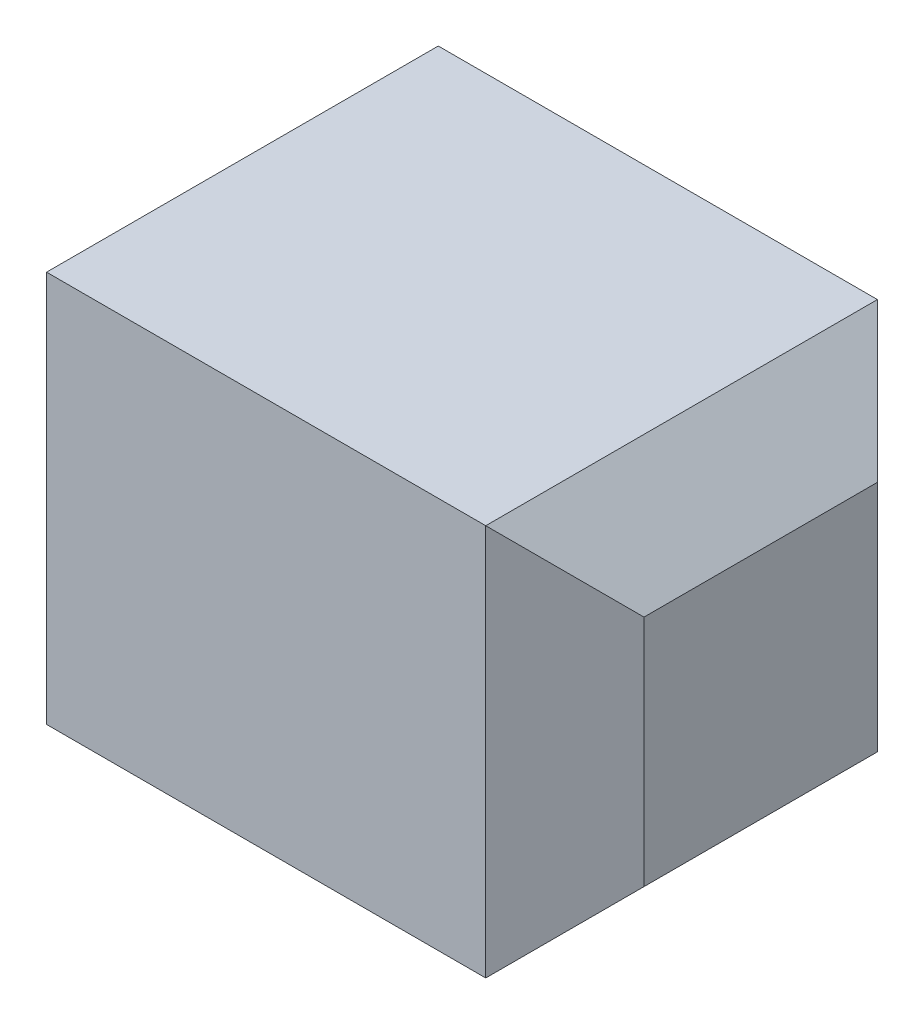
ISO-10303-21;
HEADER;
FILE_DESCRIPTION(('STEP AP214'),'2;1');
FILE_NAME('part.step','',(''),(''),'','','');
FILE_SCHEMA(('AUTOMOTIVE_DESIGN { 1 0 10303 214 1 1 1 1 }'));
ENDSEC;
DATA;
#1=APPLICATION_CONTEXT('core data for automotive mechanical design processes');
#2=APPLICATION_PROTOCOL_DEFINITION('international standard','automotive_design',2000,#1);
#3=PRODUCT_CONTEXT('',#1,'mechanical');
#4=PRODUCT('Part','Part','',(#3));
#5=PRODUCT_RELATED_PRODUCT_CATEGORY('part','',(#4));
#6=PRODUCT_DEFINITION_FORMATION('','',#4);
#7=PRODUCT_DEFINITION_CONTEXT('part definition',#1,'design');
#8=PRODUCT_DEFINITION('design','',#6,#7);
#9=PRODUCT_DEFINITION_SHAPE('','',#8);
#10=(LENGTH_UNIT() NAMED_UNIT(*) SI_UNIT(.MILLI.,.METRE.));
#11=(NAMED_UNIT(*) PLANE_ANGLE_UNIT() SI_UNIT($,.RADIAN.));
#12=(NAMED_UNIT(*) SI_UNIT($,.STERADIAN.) SOLID_ANGLE_UNIT());
#13=UNCERTAINTY_MEASURE_WITH_UNIT(LENGTH_MEASURE(1.E-05),#10,'distance_accuracy_value','');
#14=(GEOMETRIC_REPRESENTATION_CONTEXT(3) GLOBAL_UNCERTAINTY_ASSIGNED_CONTEXT((#13)) GLOBAL_UNIT_ASSIGNED_CONTEXT((#10,
#11,#12)) REPRESENTATION_CONTEXT('',''));
#15=CARTESIAN_POINT('',(0.,0.,0.));
#16=DIRECTION('',(0.,0.,1.));
#17=DIRECTION('',(1.,0.,0.));
#18=AXIS2_PLACEMENT_3D('',#15,#16,#17);
#19=CARTESIAN_POINT('',(11.43,0.,0.));
#20=DIRECTION('',(0.,0.,1.));
#21=DIRECTION('',(1.,0.,0.));
#22=AXIS2_PLACEMENT_3D('',#19,#20,#21);
#23=PLANE('',#22);
#24=DIRECTION('',(-1.,0.,0.));
#25=VECTOR('',#24,1.);
#26=CARTESIAN_POINT('',(11.43,6.2865,0.));
#27=LINE('',#26,#25);
#28=CARTESIAN_POINT('',(10.16,6.2865,0.));
#29=VERTEX_POINT('',#28);
#30=CARTESIAN_POINT('',(3.11150000000001,6.2865,0.));
#31=VERTEX_POINT('',#30);
#32=EDGE_CURVE('E111',#29,#31,#27,.T.);
#33=ORIENTED_EDGE('',*,*,#32,.T.);
#34=DIRECTION('',(0.,-1.,0.));
#35=VECTOR('',#34,1.);
#36=CARTESIAN_POINT('',(3.11150000000001,0.,0.));
#37=LINE('',#36,#35);
#38=CARTESIAN_POINT('',(3.11150000000001,0.,0.));
#39=VERTEX_POINT('',#38);
#40=EDGE_CURVE('E11',#31,#39,#37,.T.);
#41=ORIENTED_EDGE('',*,*,#40,.T.);
#42=DIRECTION('',(-1.,0.,0.));
#43=VECTOR('',#42,1.);
#44=CARTESIAN_POINT('',(11.43,0.,0.));
#45=LINE('',#44,#43);
#46=CARTESIAN_POINT('',(10.16,0.,0.));
#47=VERTEX_POINT('',#46);
#48=EDGE_CURVE('E114',#47,#39,#45,.T.);
#49=ORIENTED_EDGE('',*,*,#48,.F.);
#50=DIRECTION('',(0.,1.,0.));
#51=VECTOR('',#50,1.);
#52=CARTESIAN_POINT('',(10.16,6.2865,0.));
#53=LINE('',#52,#51);
#54=EDGE_CURVE('E110',#47,#29,#53,.T.);
#55=ORIENTED_EDGE('',*,*,#54,.T.);
#56=EDGE_LOOP('',(#33,#41,#49,#55));
#57=FACE_BOUND('',#56,.T.);
#58=ADVANCED_FACE('F41',(#57),#23,.T.);
#59=CARTESIAN_POINT('',(11.43,0.,0.));
#60=DIRECTION('',(0.,1.,0.));
#61=DIRECTION('',(0.,0.,1.));
#62=AXIS2_PLACEMENT_3D('',#59,#60,#61);
#63=PLANE('',#62);
#64=ORIENTED_EDGE('',*,*,#48,.T.);
#65=DIRECTION('',(0.,0.,-1.));
#66=VECTOR('',#65,1.);
#67=CARTESIAN_POINT('',(3.11150000000001,0.,-6.2865));
#68=LINE('',#67,#66);
#69=CARTESIAN_POINT('',(3.11150000000001,0.,-6.2865));
#70=VERTEX_POINT('',#69);
#71=EDGE_CURVE('E119',#39,#70,#68,.T.);
#72=ORIENTED_EDGE('',*,*,#71,.T.);
#73=DIRECTION('',(-1.,0.,0.));
#74=VECTOR('',#73,1.);
#75=CARTESIAN_POINT('',(11.43,0.,-6.2865));
#76=LINE('',#75,#74);
#77=CARTESIAN_POINT('',(10.16,0.,-6.2865));
#78=VERTEX_POINT('',#77);
#79=EDGE_CURVE('E145',#78,#70,#76,.T.);
#80=ORIENTED_EDGE('',*,*,#79,.F.);
#81=DIRECTION('',(0.,0.,1.));
#82=VECTOR('',#81,1.);
#83=CARTESIAN_POINT('',(10.16,0.,0.));
#84=LINE('',#83,#82);
#85=EDGE_CURVE('E120',#78,#47,#84,.T.);
#86=ORIENTED_EDGE('',*,*,#85,.T.);
#87=EDGE_LOOP('',(#64,#72,#80,#86));
#88=FACE_BOUND('',#87,.T.);
#89=ADVANCED_FACE('F200',(#88),#63,.F.);
#90=CARTESIAN_POINT('',(11.43,0.,-6.2865));
#91=DIRECTION('',(0.,0.,1.));
#92=DIRECTION('',(1.,0.,0.));
#93=AXIS2_PLACEMENT_3D('',#90,#91,#92);
#94=PLANE('',#93);
#95=ORIENTED_EDGE('',*,*,#79,.T.);
#96=DIRECTION('',(0.,1.,0.));
#97=VECTOR('',#96,1.);
#98=CARTESIAN_POINT('',(3.11150000000001,6.2865,-6.2865));
#99=LINE('',#98,#97);
#100=CARTESIAN_POINT('',(3.11150000000001,6.2865,-6.2865));
#101=VERTEX_POINT('',#100);
#102=EDGE_CURVE('E66',#70,#101,#99,.T.);
#103=ORIENTED_EDGE('',*,*,#102,.T.);
#104=DIRECTION('',(-1.,0.,0.));
#105=VECTOR('',#104,1.);
#106=CARTESIAN_POINT('',(11.43,6.2865,-6.2865));
#107=LINE('',#106,#105);
#108=CARTESIAN_POINT('',(10.16,6.2865,-6.2865));
#109=VERTEX_POINT('',#108);
#110=EDGE_CURVE('E126',#109,#101,#107,.T.);
#111=ORIENTED_EDGE('',*,*,#110,.F.);
#112=DIRECTION('',(0.,-1.,0.));
#113=VECTOR('',#112,1.);
#114=CARTESIAN_POINT('',(10.16,0.,-6.2865));
#115=LINE('',#114,#113);
#116=EDGE_CURVE('E154',#109,#78,#115,.T.);
#117=ORIENTED_EDGE('',*,*,#116,.T.);
#118=EDGE_LOOP('',(#95,#103,#111,#117));
#119=FACE_BOUND('',#118,.T.);
#120=ADVANCED_FACE('F202',(#119),#94,.F.);
#121=CARTESIAN_POINT('',(11.43,6.2865,0.));
#122=DIRECTION('',(0.,1.,0.));
#123=DIRECTION('',(0.,0.,1.));
#124=AXIS2_PLACEMENT_3D('',#121,#122,#123);
#125=PLANE('',#124);
#126=ORIENTED_EDGE('',*,*,#110,.T.);
#127=DIRECTION('',(0.,0.,1.));
#128=VECTOR('',#127,1.);
#129=CARTESIAN_POINT('',(3.11150000000001,6.2865,0.));
#130=LINE('',#129,#128);
#131=EDGE_CURVE('E51',#101,#31,#130,.T.);
#132=ORIENTED_EDGE('',*,*,#131,.T.);
#133=ORIENTED_EDGE('',*,*,#32,.F.);
#134=DIRECTION('',(0.,0.,-1.));
#135=VECTOR('',#134,1.);
#136=CARTESIAN_POINT('',(10.16,6.2865,-6.2865));
#137=LINE('',#136,#135);
#138=EDGE_CURVE('E125',#29,#109,#137,.T.);
#139=ORIENTED_EDGE('',*,*,#138,.T.);
#140=EDGE_LOOP('',(#126,#132,#133,#139));
#141=FACE_BOUND('',#140,.T.);
#142=ADVANCED_FACE('F123',(#141),#125,.T.);
#143=CARTESIAN_POINT('',(11.43,0.,0.));
#144=DIRECTION('',(-1.,0.,0.));
#145=DIRECTION('',(0.,0.,1.));
#146=AXIS2_PLACEMENT_3D('',#143,#144,#145);
#147=PLANE('',#146);
#148=DIRECTION('',(0.,1.,0.));
#149=VECTOR('',#148,1.);
#150=CARTESIAN_POINT('',(11.43,0.,-5.01649999999999));
#151=LINE('',#150,#149);
#152=CARTESIAN_POINT('',(11.43,1.27000000000001,-5.01649999999999));
#153=VERTEX_POINT('',#152);
#154=CARTESIAN_POINT('',(11.43,5.01649999999999,-5.01649999999999));
#155=VERTEX_POINT('',#154);
#156=EDGE_CURVE('E150',#153,#155,#151,.T.);
#157=ORIENTED_EDGE('',*,*,#156,.T.);
#158=DIRECTION('',(0.,0.,1.));
#159=VECTOR('',#158,1.);
#160=CARTESIAN_POINT('',(11.43,5.01649999999999,0.));
#161=LINE('',#160,#159);
#162=CARTESIAN_POINT('',(11.43,5.01649999999999,-1.27000000000001));
#163=VERTEX_POINT('',#162);
#164=EDGE_CURVE('E152',#155,#163,#161,.T.);
#165=ORIENTED_EDGE('',*,*,#164,.T.);
#166=DIRECTION('',(0.,-1.,0.));
#167=VECTOR('',#166,1.);
#168=CARTESIAN_POINT('',(11.43,0.,-1.27000000000001));
#169=LINE('',#168,#167);
#170=CARTESIAN_POINT('',(11.43,1.27000000000001,-1.27000000000001));
#171=VERTEX_POINT('',#170);
#172=EDGE_CURVE('E132',#163,#171,#169,.T.);
#173=ORIENTED_EDGE('',*,*,#172,.T.);
#174=DIRECTION('',(0.,0.,-1.));
#175=VECTOR('',#174,1.);
#176=CARTESIAN_POINT('',(11.43,1.27000000000001,0.));
#177=LINE('',#176,#175);
#178=EDGE_CURVE('E143',#171,#153,#177,.T.);
#179=ORIENTED_EDGE('',*,*,#178,.T.);
#180=EDGE_LOOP('',(#157,#165,#173,#179));
#181=FACE_BOUND('',#180,.T.);
#182=ADVANCED_FACE('F212',(#181),#147,.F.);
#183=CARTESIAN_POINT('',(0.,0.,0.));
#184=DIRECTION('',(-1.,0.,0.));
#185=DIRECTION('',(0.,0.,1.));
#186=AXIS2_PLACEMENT_3D('',#183,#184,#185);
#187=PLANE('',#186);
#188=DIRECTION('',(0.,-1.,0.));
#189=VECTOR('',#188,1.);
#190=CARTESIAN_POINT('',(0.,0.,-3.175));
#191=LINE('',#190,#189);
#192=CARTESIAN_POINT('',(0.,3.175,-3.175));
#193=VERTEX_POINT('',#192);
#194=CARTESIAN_POINT('',(0.,3.1115,-3.175));
#195=VERTEX_POINT('',#194);
#196=EDGE_CURVE('E167',#193,#195,#191,.T.);
#197=ORIENTED_EDGE('',*,*,#196,.T.);
#198=DIRECTION('',(0.,0.,1.));
#199=VECTOR('',#198,1.);
#200=CARTESIAN_POINT('',(0.,3.1115,0.));
#201=LINE('',#200,#199);
#202=CARTESIAN_POINT('',(0.,3.1115,-3.1115));
#203=VERTEX_POINT('',#202);
#204=EDGE_CURVE('E169',#195,#203,#201,.T.);
#205=ORIENTED_EDGE('',*,*,#204,.T.);
#206=DIRECTION('',(0.,1.,0.));
#207=VECTOR('',#206,1.);
#208=CARTESIAN_POINT('',(0.,0.,-3.1115));
#209=LINE('',#208,#207);
#210=CARTESIAN_POINT('',(0.,3.175,-3.1115));
#211=VERTEX_POINT('',#210);
#212=EDGE_CURVE('E163',#203,#211,#209,.T.);
#213=ORIENTED_EDGE('',*,*,#212,.T.);
#214=DIRECTION('',(0.,0.,-1.));
#215=VECTOR('',#214,1.);
#216=CARTESIAN_POINT('',(0.,3.175,0.));
#217=LINE('',#216,#215);
#218=EDGE_CURVE('E165',#211,#193,#217,.T.);
#219=ORIENTED_EDGE('',*,*,#218,.T.);
#220=EDGE_LOOP('',(#197,#205,#213,#219));
#221=FACE_BOUND('',#220,.T.);
#222=ADVANCED_FACE('F191',(#221),#187,.T.);
#223=CARTESIAN_POINT('',(11.43,1.27000000000001,0.));
#224=DIRECTION('',(-0.707106781186549,0.707106781186546,0.));
#225=DIRECTION('',(0.,0.,-1.));
#226=AXIS2_PLACEMENT_3D('',#223,#224,#225);
#227=PLANE('',#226);
#228=DIRECTION('',(0.577350269189624,0.577350269189627,0.577350269189627));
#229=VECTOR('',#228,1.);
#230=CARTESIAN_POINT('',(13.1021666666667,2.94216666666668,-3.34433333333333));
#231=LINE('',#230,#229);
#232=EDGE_CURVE('E136',#153,#78,#231,.F.);
#233=ORIENTED_EDGE('',*,*,#232,.F.);
#234=ORIENTED_EDGE('',*,*,#178,.F.);
#235=DIRECTION('',(-0.577350269189624,-0.577350269189627,0.577350269189627));
#236=VECTOR('',#235,1.);
#237=CARTESIAN_POINT('',(10.16,0.,0.));
#238=LINE('',#237,#236);
#239=EDGE_CURVE('E127',#47,#171,#238,.F.);
#240=ORIENTED_EDGE('',*,*,#239,.F.);
#241=ORIENTED_EDGE('',*,*,#85,.F.);
#242=EDGE_LOOP('',(#233,#234,#240,#241));
#243=FACE_BOUND('',#242,.T.);
#244=ADVANCED_FACE('F210',(#243),#227,.F.);
#245=CARTESIAN_POINT('',(10.16,0.,0.));
#246=DIRECTION('',(0.707106781186549,0.,0.707106781186546));
#247=DIRECTION('',(0.,-1.,0.));
#248=AXIS2_PLACEMENT_3D('',#245,#246,#247);
#249=PLANE('',#248);
#250=ORIENTED_EDGE('',*,*,#239,.T.);
#251=ORIENTED_EDGE('',*,*,#172,.F.);
#252=DIRECTION('',(-0.577350269189624,0.577350269189627,0.577350269189627));
#253=VECTOR('',#252,1.);
#254=CARTESIAN_POINT('',(12.2555,4.19099999999999,-2.09550000000001));
#255=LINE('',#254,#253);
#256=EDGE_CURVE('E130',#29,#163,#255,.F.);
#257=ORIENTED_EDGE('',*,*,#256,.F.);
#258=ORIENTED_EDGE('',*,*,#54,.F.);
#259=EDGE_LOOP('',(#250,#251,#257,#258));
#260=FACE_BOUND('',#259,.T.);
#261=ADVANCED_FACE('F131',(#260),#249,.T.);
#262=CARTESIAN_POINT('',(11.43,0.,-5.01649999999999));
#263=DIRECTION('',(-0.707106781186549,0.,0.707106781186546));
#264=DIRECTION('',(0.,1.,0.));
#265=AXIS2_PLACEMENT_3D('',#262,#263,#264);
#266=PLANE('',#265);
#267=ORIENTED_EDGE('',*,*,#232,.T.);
#268=ORIENTED_EDGE('',*,*,#116,.F.);
#269=DIRECTION('',(-0.577350269189624,0.577350269189627,-0.577350269189627));
#270=VECTOR('',#269,1.);
#271=CARTESIAN_POINT('',(13.1021666666667,3.34433333333333,-3.34433333333332));
#272=LINE('',#271,#270);
#273=EDGE_CURVE('E137',#155,#109,#272,.T.);
#274=ORIENTED_EDGE('',*,*,#273,.F.);
#275=ORIENTED_EDGE('',*,*,#156,.F.);
#276=EDGE_LOOP('',(#267,#268,#274,#275));
#277=FACE_BOUND('',#276,.T.);
#278=ADVANCED_FACE('F205',(#277),#266,.F.);
#279=CARTESIAN_POINT('',(10.16,6.2865,0.));
#280=DIRECTION('',(0.707106781186549,0.707106781186546,0.));
#281=DIRECTION('',(0.,0.,1.));
#282=AXIS2_PLACEMENT_3D('',#279,#280,#281);
#283=PLANE('',#282);
#284=ORIENTED_EDGE('',*,*,#256,.T.);
#285=ORIENTED_EDGE('',*,*,#164,.F.);
#286=ORIENTED_EDGE('',*,*,#273,.T.);
#287=ORIENTED_EDGE('',*,*,#138,.F.);
#288=EDGE_LOOP('',(#284,#285,#286,#287));
#289=FACE_BOUND('',#288,.T.);
#290=ADVANCED_FACE('F139',(#289),#283,.T.);
#291=CARTESIAN_POINT('',(0.,3.175,0.));
#292=DIRECTION('',(0.707106781186546,-0.707106781186549,0.));
#293=DIRECTION('',(0.,0.,-1.));
#294=AXIS2_PLACEMENT_3D('',#291,#292,#293);
#295=PLANE('',#294);
#296=DIRECTION('',(0.577350269189627,0.577350269189625,-0.577350269189625));
#297=VECTOR('',#296,1.);
#298=CARTESIAN_POINT('',(-1.05833333333333,2.11666666666667,-2.11666666666667));
#299=LINE('',#298,#297);
#300=EDGE_CURVE('E177',#193,#101,#299,.T.);
#301=ORIENTED_EDGE('',*,*,#300,.F.);
#302=ORIENTED_EDGE('',*,*,#218,.F.);
#303=DIRECTION('',(-0.577350269189627,-0.577350269189625,-0.577350269189625));
#304=VECTOR('',#303,1.);
#305=CARTESIAN_POINT('',(-1.05833333333333,2.11666666666667,-4.16983333333333));
#306=LINE('',#305,#304);
#307=EDGE_CURVE('E46',#31,#211,#306,.T.);
#308=ORIENTED_EDGE('',*,*,#307,.F.);
#309=ORIENTED_EDGE('',*,*,#131,.F.);
#310=EDGE_LOOP('',(#301,#302,#308,#309));
#311=FACE_BOUND('',#310,.T.);
#312=ADVANCED_FACE('F44',(#311),#295,.F.);
#313=CARTESIAN_POINT('',(0.,0.,-3.1115));
#314=DIRECTION('',(0.707106781186546,0.,-0.707106781186549));
#315=DIRECTION('',(0.,1.,0.));
#316=AXIS2_PLACEMENT_3D('',#313,#314,#315);
#317=PLANE('',#316);
#318=ORIENTED_EDGE('',*,*,#307,.T.);
#319=ORIENTED_EDGE('',*,*,#212,.F.);
#320=DIRECTION('',(-0.577350269189627,0.577350269189625,-0.577350269189625));
#321=VECTOR('',#320,1.);
#322=CARTESIAN_POINT('',(1.03716666666667,2.07433333333334,-2.07433333333334));
#323=LINE('',#322,#321);
#324=EDGE_CURVE('E176',#39,#203,#323,.T.);
#325=ORIENTED_EDGE('',*,*,#324,.F.);
#326=ORIENTED_EDGE('',*,*,#40,.F.);
#327=EDGE_LOOP('',(#318,#319,#325,#326));
#328=FACE_BOUND('',#327,.T.);
#329=ADVANCED_FACE('F186',(#328),#317,.F.);
#330=CARTESIAN_POINT('',(3.11150000000001,0.,-6.2865));
#331=DIRECTION('',(-0.707106781186546,0.,-0.707106781186549));
#332=DIRECTION('',(0.,-1.,0.));
#333=AXIS2_PLACEMENT_3D('',#330,#331,#332);
#334=PLANE('',#333);
#335=ORIENTED_EDGE('',*,*,#300,.T.);
#336=ORIENTED_EDGE('',*,*,#102,.F.);
#337=DIRECTION('',(-0.577350269189627,0.577350269189625,0.577350269189625));
#338=VECTOR('',#337,1.);
#339=CARTESIAN_POINT('',(3.11150000000001,0.,-6.2865));
#340=LINE('',#339,#338);
#341=EDGE_CURVE('E174',#195,#70,#340,.F.);
#342=ORIENTED_EDGE('',*,*,#341,.F.);
#343=ORIENTED_EDGE('',*,*,#196,.F.);
#344=EDGE_LOOP('',(#335,#336,#342,#343));
#345=FACE_BOUND('',#344,.T.);
#346=ADVANCED_FACE('F197',(#345),#334,.T.);
#347=CARTESIAN_POINT('',(3.11150000000001,0.,0.));
#348=DIRECTION('',(-0.707106781186546,-0.707106781186549,0.));
#349=DIRECTION('',(0.,0.,1.));
#350=AXIS2_PLACEMENT_3D('',#347,#348,#349);
#351=PLANE('',#350);
#352=ORIENTED_EDGE('',*,*,#324,.T.);
#353=ORIENTED_EDGE('',*,*,#204,.F.);
#354=ORIENTED_EDGE('',*,*,#341,.T.);
#355=ORIENTED_EDGE('',*,*,#71,.F.);
#356=EDGE_LOOP('',(#352,#353,#354,#355));
#357=FACE_BOUND('',#356,.T.);
#358=ADVANCED_FACE('F195',(#357),#351,.T.);
#359=CLOSED_SHELL('',(#58,#89,#120,#142,#182,#222,#244,#261,#278,#290,#312,#329,#346,#358));
#360=MANIFOLD_SOLID_BREP('B2',#359);
#361=ADVANCED_BREP_SHAPE_REPRESENTATION('',(#18,#360),#14);
#362=SHAPE_DEFINITION_REPRESENTATION(#9,#361);
ENDSEC;
END-ISO-10303-21;
